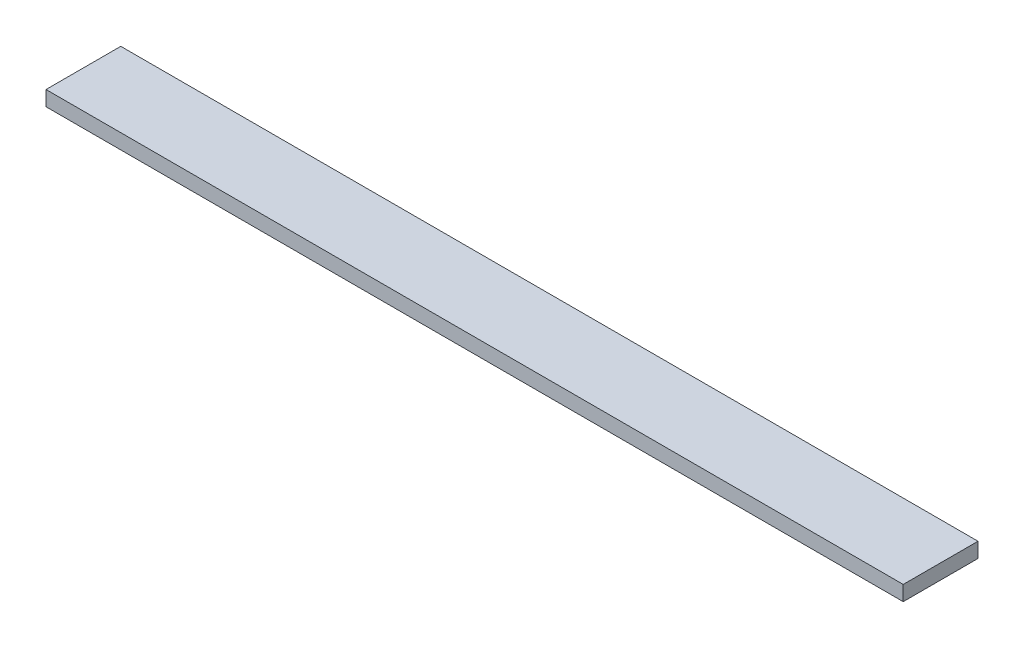
ISO-10303-21;
HEADER;
FILE_DESCRIPTION(('STEP AP214'),'2;1');
FILE_NAME('part.step','',(''),(''),'','','');
FILE_SCHEMA(('AUTOMOTIVE_DESIGN { 1 0 10303 214 1 1 1 1 }'));
ENDSEC;
DATA;
#1=APPLICATION_CONTEXT('core data for automotive mechanical design processes');
#2=APPLICATION_PROTOCOL_DEFINITION('international standard','automotive_design',2000,#1);
#3=PRODUCT_CONTEXT('',#1,'mechanical');
#4=PRODUCT('Part','Part','',(#3));
#5=PRODUCT_RELATED_PRODUCT_CATEGORY('part','',(#4));
#6=PRODUCT_DEFINITION_FORMATION('','',#4);
#7=PRODUCT_DEFINITION_CONTEXT('part definition',#1,'design');
#8=PRODUCT_DEFINITION('design','',#6,#7);
#9=PRODUCT_DEFINITION_SHAPE('','',#8);
#10=(LENGTH_UNIT() NAMED_UNIT(*) SI_UNIT(.MILLI.,.METRE.));
#11=(NAMED_UNIT(*) PLANE_ANGLE_UNIT() SI_UNIT($,.RADIAN.));
#12=(NAMED_UNIT(*) SI_UNIT($,.STERADIAN.) SOLID_ANGLE_UNIT());
#13=UNCERTAINTY_MEASURE_WITH_UNIT(LENGTH_MEASURE(1.E-05),#10,'distance_accuracy_value','');
#14=(GEOMETRIC_REPRESENTATION_CONTEXT(3) GLOBAL_UNCERTAINTY_ASSIGNED_CONTEXT((#13)) GLOBAL_UNIT_ASSIGNED_CONTEXT((#10,
#11,#12)) REPRESENTATION_CONTEXT('',''));
#15=CARTESIAN_POINT('',(0.,0.,0.));
#16=DIRECTION('',(0.,0.,1.));
#17=DIRECTION('',(1.,0.,0.));
#18=AXIS2_PLACEMENT_3D('',#15,#16,#17);
#19=CARTESIAN_POINT('',(-37.1634835824855,2.,-12.7648487087667));
#20=DIRECTION('',(1.,0.,0.));
#21=DIRECTION('',(0.,0.,-1.));
#22=AXIS2_PLACEMENT_3D('',#19,#20,#21);
#23=PLANE('',#22);
#24=DIRECTION('',(0.,0.,1.));
#25=VECTOR('',#24,1.);
#26=CARTESIAN_POINT('',(-37.1634835824855,0.,-12.7648487087667));
#27=LINE('',#26,#25);
#28=CARTESIAN_POINT('',(-37.1634835824855,0.,-12.7648487087667));
#29=VERTEX_POINT('',#28);
#30=CARTESIAN_POINT('',(-37.1634835824855,0.,-2.76484870876675));
#31=VERTEX_POINT('',#30);
#32=EDGE_CURVE('E98',#29,#31,#27,.T.);
#33=ORIENTED_EDGE('',*,*,#32,.T.);
#34=DIRECTION('',(0.,-1.,0.));
#35=VECTOR('',#34,1.);
#36=CARTESIAN_POINT('',(-37.1634835824855,2.,-2.76484870876675));
#37=LINE('',#36,#35);
#38=CARTESIAN_POINT('',(-37.1634835824855,2.,-2.76484870876675));
#39=VERTEX_POINT('',#38);
#40=EDGE_CURVE('E11',#39,#31,#37,.T.);
#41=ORIENTED_EDGE('',*,*,#40,.F.);
#42=DIRECTION('',(0.,0.,1.));
#43=VECTOR('',#42,1.);
#44=CARTESIAN_POINT('',(-37.1634835824855,2.,-12.7648487087667));
#45=LINE('',#44,#43);
#46=CARTESIAN_POINT('',(-37.1634835824855,2.,-12.7648487087667));
#47=VERTEX_POINT('',#46);
#48=EDGE_CURVE('E86',#47,#39,#45,.T.);
#49=ORIENTED_EDGE('',*,*,#48,.F.);
#50=DIRECTION('',(0.,-1.,0.));
#51=VECTOR('',#50,1.);
#52=CARTESIAN_POINT('',(-37.1634835824855,2.,-12.7648487087667));
#53=LINE('',#52,#51);
#54=EDGE_CURVE('E94',#47,#29,#53,.T.);
#55=ORIENTED_EDGE('',*,*,#54,.T.);
#56=EDGE_LOOP('',(#33,#41,#49,#55));
#57=FACE_BOUND('',#56,.T.);
#58=ADVANCED_FACE('F35',(#57),#23,.F.);
#59=CARTESIAN_POINT('',(-37.1634835824855,2.,-2.76484870876675));
#60=DIRECTION('',(0.,0.,-1.));
#61=DIRECTION('',(-1.,0.,0.));
#62=AXIS2_PLACEMENT_3D('',#59,#60,#61);
#63=PLANE('',#62);
#64=DIRECTION('',(1.,0.,0.));
#65=VECTOR('',#64,1.);
#66=CARTESIAN_POINT('',(-37.1634835824855,0.,-2.76484870876675));
#67=LINE('',#66,#65);
#68=CARTESIAN_POINT('',(77.4665164175145,0.,-2.76484870876675));
#69=VERTEX_POINT('',#68);
#70=EDGE_CURVE('E90',#31,#69,#67,.T.);
#71=ORIENTED_EDGE('',*,*,#70,.T.);
#72=DIRECTION('',(0.,-1.,0.));
#73=VECTOR('',#72,1.);
#74=CARTESIAN_POINT('',(77.4665164175145,2.,-2.76484870876675));
#75=LINE('',#74,#73);
#76=CARTESIAN_POINT('',(77.4665164175145,2.,-2.76484870876675));
#77=VERTEX_POINT('',#76);
#78=EDGE_CURVE('E43',#77,#69,#75,.T.);
#79=ORIENTED_EDGE('',*,*,#78,.F.);
#80=DIRECTION('',(1.,0.,0.));
#81=VECTOR('',#80,1.);
#82=CARTESIAN_POINT('',(-37.1634835824855,2.,-2.76484870876675));
#83=LINE('',#82,#81);
#84=EDGE_CURVE('E81',#39,#77,#83,.T.);
#85=ORIENTED_EDGE('',*,*,#84,.F.);
#86=ORIENTED_EDGE('',*,*,#40,.T.);
#87=EDGE_LOOP('',(#71,#79,#85,#86));
#88=FACE_BOUND('',#87,.T.);
#89=ADVANCED_FACE('F89',(#88),#63,.F.);
#90=CARTESIAN_POINT('',(77.4665164175145,2.,-12.7648487087667));
#91=DIRECTION('',(-1.,0.,0.));
#92=DIRECTION('',(0.,0.,1.));
#93=AXIS2_PLACEMENT_3D('',#90,#91,#92);
#94=PLANE('',#93);
#95=DIRECTION('',(0.,0.,-1.));
#96=VECTOR('',#95,1.);
#97=CARTESIAN_POINT('',(77.4665164175145,0.,-12.7648487087667));
#98=LINE('',#97,#96);
#99=CARTESIAN_POINT('',(77.4665164175145,0.,-12.7648487087667));
#100=VERTEX_POINT('',#99);
#101=EDGE_CURVE('E68',#69,#100,#98,.T.);
#102=ORIENTED_EDGE('',*,*,#101,.T.);
#103=DIRECTION('',(0.,-1.,0.));
#104=VECTOR('',#103,1.);
#105=CARTESIAN_POINT('',(77.4665164175145,2.,-12.7648487087667));
#106=LINE('',#105,#104);
#107=CARTESIAN_POINT('',(77.4665164175145,2.,-12.7648487087667));
#108=VERTEX_POINT('',#107);
#109=EDGE_CURVE('E91',#108,#100,#106,.T.);
#110=ORIENTED_EDGE('',*,*,#109,.F.);
#111=DIRECTION('',(0.,0.,-1.));
#112=VECTOR('',#111,1.);
#113=CARTESIAN_POINT('',(77.4665164175145,2.,-12.7648487087667));
#114=LINE('',#113,#112);
#115=EDGE_CURVE('E84',#77,#108,#114,.T.);
#116=ORIENTED_EDGE('',*,*,#115,.F.);
#117=ORIENTED_EDGE('',*,*,#78,.T.);
#118=EDGE_LOOP('',(#102,#110,#116,#117));
#119=FACE_BOUND('',#118,.T.);
#120=ADVANCED_FACE('F92',(#119),#94,.F.);
#121=CARTESIAN_POINT('',(-37.1634835824855,2.,-12.7648487087667));
#122=DIRECTION('',(0.,0.,1.));
#123=DIRECTION('',(1.,0.,0.));
#124=AXIS2_PLACEMENT_3D('',#121,#122,#123);
#125=PLANE('',#124);
#126=DIRECTION('',(-1.,0.,0.));
#127=VECTOR('',#126,1.);
#128=CARTESIAN_POINT('',(-37.1634835824855,0.,-12.7648487087667));
#129=LINE('',#128,#127);
#130=EDGE_CURVE('E74',#100,#29,#129,.T.);
#131=ORIENTED_EDGE('',*,*,#130,.T.);
#132=ORIENTED_EDGE('',*,*,#54,.F.);
#133=DIRECTION('',(-1.,0.,0.));
#134=VECTOR('',#133,1.);
#135=CARTESIAN_POINT('',(-37.1634835824855,2.,-12.7648487087667));
#136=LINE('',#135,#134);
#137=EDGE_CURVE('E51',#108,#47,#136,.T.);
#138=ORIENTED_EDGE('',*,*,#137,.F.);
#139=ORIENTED_EDGE('',*,*,#109,.T.);
#140=EDGE_LOOP('',(#131,#132,#138,#139));
#141=FACE_BOUND('',#140,.T.);
#142=ADVANCED_FACE('F105',(#141),#125,.F.);
#143=CARTESIAN_POINT('',(0.,2.,0.));
#144=DIRECTION('',(0.,1.,0.));
#145=DIRECTION('',(0.,0.,1.));
#146=AXIS2_PLACEMENT_3D('',#143,#144,#145);
#147=PLANE('',#146);
#148=ORIENTED_EDGE('',*,*,#48,.T.);
#149=ORIENTED_EDGE('',*,*,#84,.T.);
#150=ORIENTED_EDGE('',*,*,#115,.T.);
#151=ORIENTED_EDGE('',*,*,#137,.T.);
#152=EDGE_LOOP('',(#148,#149,#150,#151));
#153=FACE_BOUND('',#152,.T.);
#154=ADVANCED_FACE('F82',(#153),#147,.T.);
#155=CARTESIAN_POINT('',(0.,0.,0.));
#156=DIRECTION('',(0.,1.,0.));
#157=DIRECTION('',(0.,0.,1.));
#158=AXIS2_PLACEMENT_3D('',#155,#156,#157);
#159=PLANE('',#158);
#160=ORIENTED_EDGE('',*,*,#32,.F.);
#161=ORIENTED_EDGE('',*,*,#130,.F.);
#162=ORIENTED_EDGE('',*,*,#101,.F.);
#163=ORIENTED_EDGE('',*,*,#70,.F.);
#164=EDGE_LOOP('',(#160,#161,#162,#163));
#165=FACE_BOUND('',#164,.T.);
#166=ADVANCED_FACE('F108',(#165),#159,.F.);
#167=CLOSED_SHELL('',(#58,#89,#120,#142,#154,#166));
#168=MANIFOLD_SOLID_BREP('B2',#167);
#169=ADVANCED_BREP_SHAPE_REPRESENTATION('',(#18,#168),#14);
#170=SHAPE_DEFINITION_REPRESENTATION(#9,#169);
ENDSEC;
END-ISO-10303-21;
